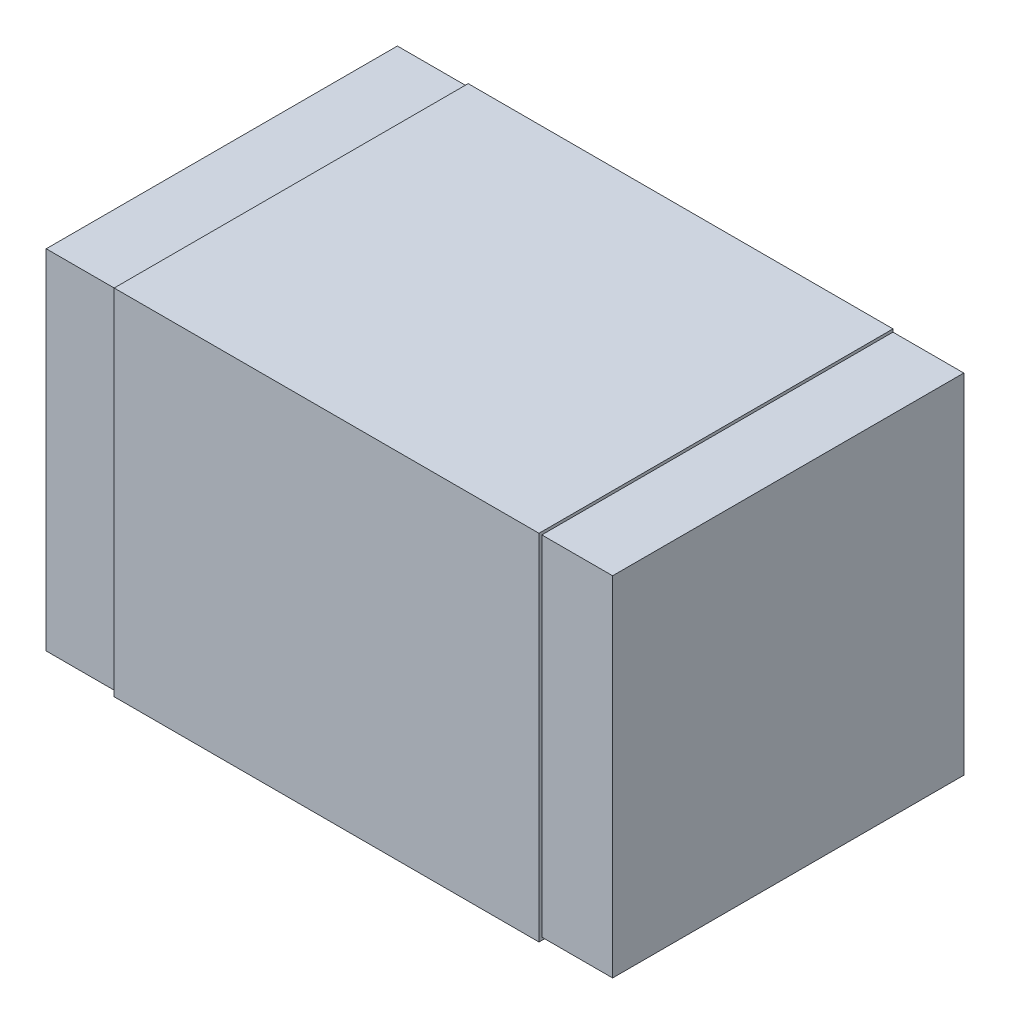
ISO-10303-21;
HEADER;
FILE_DESCRIPTION(('STEP AP214'),'2;1');
FILE_NAME('part.step','',(''),(''),'','','');
FILE_SCHEMA(('AUTOMOTIVE_DESIGN { 1 0 10303 214 1 1 1 1 }'));
ENDSEC;
DATA;
#1=APPLICATION_CONTEXT('core data for automotive mechanical design processes');
#2=APPLICATION_PROTOCOL_DEFINITION('international standard','automotive_design',2000,#1);
#3=PRODUCT_CONTEXT('',#1,'mechanical');
#4=PRODUCT('Part','Part','',(#3));
#5=PRODUCT_RELATED_PRODUCT_CATEGORY('part','',(#4));
#6=PRODUCT_DEFINITION_FORMATION('','',#4);
#7=PRODUCT_DEFINITION_CONTEXT('part definition',#1,'design');
#8=PRODUCT_DEFINITION('design','',#6,#7);
#9=PRODUCT_DEFINITION_SHAPE('','',#8);
#10=(LENGTH_UNIT() NAMED_UNIT(*) SI_UNIT(.MILLI.,.METRE.));
#11=(NAMED_UNIT(*) PLANE_ANGLE_UNIT() SI_UNIT($,.RADIAN.));
#12=(NAMED_UNIT(*) SI_UNIT($,.STERADIAN.) SOLID_ANGLE_UNIT());
#13=UNCERTAINTY_MEASURE_WITH_UNIT(LENGTH_MEASURE(1.E-05),#10,'distance_accuracy_value','');
#14=(GEOMETRIC_REPRESENTATION_CONTEXT(3) GLOBAL_UNCERTAINTY_ASSIGNED_CONTEXT((#13)) GLOBAL_UNIT_ASSIGNED_CONTEXT((#10,
#11,#12)) REPRESENTATION_CONTEXT('',''));
#15=CARTESIAN_POINT('',(0.,0.,0.));
#16=DIRECTION('',(0.,0.,1.));
#17=DIRECTION('',(1.,0.,0.));
#18=AXIS2_PLACEMENT_3D('',#15,#16,#17);
#19=CARTESIAN_POINT('',(0.,0.,1.24));
#20=DIRECTION('',(0.,0.,-1.));
#21=DIRECTION('',(-1.,0.,0.));
#22=AXIS2_PLACEMENT_3D('',#19,#20,#21);
#23=PLANE('',#22);
#24=DIRECTION('',(1.,0.,0.));
#25=VECTOR('',#24,1.);
#26=CARTESIAN_POINT('',(-0.75,0.615,1.24));
#27=LINE('',#26,#25);
#28=CARTESIAN_POINT('',(-1.,0.615,1.24));
#29=VERTEX_POINT('',#28);
#30=CARTESIAN_POINT('',(-0.75,0.615,1.24));
#31=VERTEX_POINT('',#30);
#32=EDGE_CURVE('E131',#29,#31,#27,.T.);
#33=ORIENTED_EDGE('',*,*,#32,.F.);
#34=DIRECTION('',(0.,-1.,0.));
#35=VECTOR('',#34,1.);
#36=CARTESIAN_POINT('',(-1.,0.615,1.24));
#37=LINE('',#36,#35);
#38=CARTESIAN_POINT('',(-1.,-0.615,1.24));
#39=VERTEX_POINT('',#38);
#40=EDGE_CURVE('E133',#39,#29,#37,.F.);
#41=ORIENTED_EDGE('',*,*,#40,.F.);
#42=DIRECTION('',(1.,0.,0.));
#43=VECTOR('',#42,1.);
#44=CARTESIAN_POINT('',(-0.75,-0.615,1.24));
#45=LINE('',#44,#43);
#46=CARTESIAN_POINT('',(-0.75,-0.615,1.24));
#47=VERTEX_POINT('',#46);
#48=EDGE_CURVE('E137',#47,#39,#45,.F.);
#49=ORIENTED_EDGE('',*,*,#48,.F.);
#50=DIRECTION('',(0.,1.,0.));
#51=VECTOR('',#50,1.);
#52=CARTESIAN_POINT('',(-0.75,0.625,1.24));
#53=LINE('',#52,#51);
#54=EDGE_CURVE('E149',#47,#31,#53,.T.);
#55=ORIENTED_EDGE('',*,*,#54,.T.);
#56=EDGE_LOOP('',(#33,#41,#49,#55));
#57=FACE_BOUND('',#56,.T.);
#58=ADVANCED_FACE('F16',(#57),#23,.F.);
#59=CARTESIAN_POINT('',(0.,0.,1.25));
#60=DIRECTION('',(0.,0.,1.));
#61=DIRECTION('',(1.,0.,0.));
#62=AXIS2_PLACEMENT_3D('',#59,#60,#61);
#63=PLANE('',#62);
#64=DIRECTION('',(0.,1.,0.));
#65=VECTOR('',#64,1.);
#66=CARTESIAN_POINT('',(-0.75,0.625,1.25));
#67=LINE('',#66,#65);
#68=CARTESIAN_POINT('',(-0.75,0.625,1.25));
#69=VERTEX_POINT('',#68);
#70=CARTESIAN_POINT('',(-0.75,-0.625,1.25));
#71=VERTEX_POINT('',#70);
#72=EDGE_CURVE('E144',#69,#71,#67,.F.);
#73=ORIENTED_EDGE('',*,*,#72,.T.);
#74=DIRECTION('',(1.,0.,0.));
#75=VECTOR('',#74,1.);
#76=CARTESIAN_POINT('',(-0.75,-0.625,1.25));
#77=LINE('',#76,#75);
#78=CARTESIAN_POINT('',(0.75,-0.625,1.25));
#79=VERTEX_POINT('',#78);
#80=EDGE_CURVE('E157',#71,#79,#77,.T.);
#81=ORIENTED_EDGE('',*,*,#80,.T.);
#82=DIRECTION('',(0.,-1.,0.));
#83=VECTOR('',#82,1.);
#84=CARTESIAN_POINT('',(0.75,0.625,1.25));
#85=LINE('',#84,#83);
#86=CARTESIAN_POINT('',(0.75,0.625,1.25));
#87=VERTEX_POINT('',#86);
#88=EDGE_CURVE('E160',#79,#87,#85,.F.);
#89=ORIENTED_EDGE('',*,*,#88,.T.);
#90=DIRECTION('',(1.,0.,0.));
#91=VECTOR('',#90,1.);
#92=CARTESIAN_POINT('',(-0.75,0.625,1.25));
#93=LINE('',#92,#91);
#94=EDGE_CURVE('E129',#87,#69,#93,.F.);
#95=ORIENTED_EDGE('',*,*,#94,.T.);
#96=EDGE_LOOP('',(#73,#81,#89,#95));
#97=FACE_BOUND('',#96,.T.);
#98=ADVANCED_FACE('F345',(#97),#63,.T.);
#99=CARTESIAN_POINT('',(0.,0.,1.24));
#100=DIRECTION('',(0.,0.,1.));
#101=DIRECTION('',(1.,0.,0.));
#102=AXIS2_PLACEMENT_3D('',#99,#100,#101);
#103=PLANE('',#102);
#104=DIRECTION('',(0.,1.,0.));
#105=VECTOR('',#104,1.);
#106=CARTESIAN_POINT('',(1.,0.615,1.24));
#107=LINE('',#106,#105);
#108=CARTESIAN_POINT('',(1.,0.615,1.24));
#109=VERTEX_POINT('',#108);
#110=CARTESIAN_POINT('',(1.,-0.615,1.24));
#111=VERTEX_POINT('',#110);
#112=EDGE_CURVE('E106',#109,#111,#107,.F.);
#113=ORIENTED_EDGE('',*,*,#112,.F.);
#114=DIRECTION('',(-1.,0.,0.));
#115=VECTOR('',#114,1.);
#116=CARTESIAN_POINT('',(0.75,0.615,1.24));
#117=LINE('',#116,#115);
#118=CARTESIAN_POINT('',(0.75,0.615,1.24));
#119=VERTEX_POINT('',#118);
#120=EDGE_CURVE('E101',#119,#109,#117,.F.);
#121=ORIENTED_EDGE('',*,*,#120,.F.);
#122=DIRECTION('',(0.,-1.,0.));
#123=VECTOR('',#122,1.);
#124=CARTESIAN_POINT('',(0.75,0.625,1.24));
#125=LINE('',#124,#123);
#126=CARTESIAN_POINT('',(0.75,-0.615,1.24));
#127=VERTEX_POINT('',#126);
#128=EDGE_CURVE('E118',#119,#127,#125,.T.);
#129=ORIENTED_EDGE('',*,*,#128,.T.);
#130=DIRECTION('',(1.,0.,0.));
#131=VECTOR('',#130,1.);
#132=CARTESIAN_POINT('',(0.75,-0.615,1.24));
#133=LINE('',#132,#131);
#134=EDGE_CURVE('E19',#111,#127,#133,.F.);
#135=ORIENTED_EDGE('',*,*,#134,.F.);
#136=EDGE_LOOP('',(#113,#121,#129,#135));
#137=FACE_BOUND('',#136,.T.);
#138=ADVANCED_FACE('F116',(#137),#103,.T.);
#139=CARTESIAN_POINT('',(0.75,-0.615,1.24));
#140=DIRECTION('',(0.,-1.,0.));
#141=DIRECTION('',(1.,0.,0.));
#142=AXIS2_PLACEMENT_3D('',#139,#140,#141);
#143=PLANE('',#142);
#144=ORIENTED_EDGE('',*,*,#134,.T.);
#145=DIRECTION('',(0.,0.,1.));
#146=VECTOR('',#145,1.);
#147=CARTESIAN_POINT('',(0.75,-0.615,1.25));
#148=LINE('',#147,#146);
#149=CARTESIAN_POINT('',(0.75,-0.615,0.));
#150=VERTEX_POINT('',#149);
#151=EDGE_CURVE('E168',#127,#150,#148,.F.);
#152=ORIENTED_EDGE('',*,*,#151,.T.);
#153=DIRECTION('',(1.,0.,0.));
#154=VECTOR('',#153,1.);
#155=CARTESIAN_POINT('',(0.,-0.615,0.));
#156=LINE('',#155,#154);
#157=CARTESIAN_POINT('',(1.,-0.615,0.));
#158=VERTEX_POINT('',#157);
#159=EDGE_CURVE('E124',#150,#158,#156,.T.);
#160=ORIENTED_EDGE('',*,*,#159,.T.);
#161=DIRECTION('',(0.,0.,1.));
#162=VECTOR('',#161,1.);
#163=CARTESIAN_POINT('',(1.,-0.615,1.24));
#164=LINE('',#163,#162);
#165=EDGE_CURVE('E111',#111,#158,#164,.F.);
#166=ORIENTED_EDGE('',*,*,#165,.F.);
#167=EDGE_LOOP('',(#144,#152,#160,#166));
#168=FACE_BOUND('',#167,.T.);
#169=ADVANCED_FACE('F123',(#168),#143,.T.);
#170=CARTESIAN_POINT('',(1.,0.615,1.24));
#171=DIRECTION('',(1.,0.,0.));
#172=DIRECTION('',(0.,1.,0.));
#173=AXIS2_PLACEMENT_3D('',#170,#171,#172);
#174=PLANE('',#173);
#175=ORIENTED_EDGE('',*,*,#112,.T.);
#176=ORIENTED_EDGE('',*,*,#165,.T.);
#177=DIRECTION('',(0.,1.,0.));
#178=VECTOR('',#177,1.);
#179=CARTESIAN_POINT('',(1.,0.,0.));
#180=LINE('',#179,#178);
#181=CARTESIAN_POINT('',(1.,0.615,0.));
#182=VERTEX_POINT('',#181);
#183=EDGE_CURVE('E171',#158,#182,#180,.T.);
#184=ORIENTED_EDGE('',*,*,#183,.T.);
#185=DIRECTION('',(0.,0.,1.));
#186=VECTOR('',#185,1.);
#187=CARTESIAN_POINT('',(1.,0.615,1.24));
#188=LINE('',#187,#186);
#189=EDGE_CURVE('E113',#109,#182,#188,.F.);
#190=ORIENTED_EDGE('',*,*,#189,.F.);
#191=EDGE_LOOP('',(#175,#176,#184,#190));
#192=FACE_BOUND('',#191,.T.);
#193=ADVANCED_FACE('F108',(#192),#174,.T.);
#194=CARTESIAN_POINT('',(0.75,0.615,1.24));
#195=DIRECTION('',(0.,1.,0.));
#196=DIRECTION('',(-1.,0.,0.));
#197=AXIS2_PLACEMENT_3D('',#194,#195,#196);
#198=PLANE('',#197);
#199=ORIENTED_EDGE('',*,*,#120,.T.);
#200=ORIENTED_EDGE('',*,*,#189,.T.);
#201=DIRECTION('',(1.,0.,0.));
#202=VECTOR('',#201,1.);
#203=CARTESIAN_POINT('',(0.,0.615,0.));
#204=LINE('',#203,#202);
#205=CARTESIAN_POINT('',(0.75,0.615,0.));
#206=VERTEX_POINT('',#205);
#207=EDGE_CURVE('E173',#182,#206,#204,.F.);
#208=ORIENTED_EDGE('',*,*,#207,.T.);
#209=DIRECTION('',(0.,0.,1.));
#210=VECTOR('',#209,1.);
#211=CARTESIAN_POINT('',(0.75,0.615,1.25));
#212=LINE('',#211,#210);
#213=EDGE_CURVE('E165',#206,#119,#212,.T.);
#214=ORIENTED_EDGE('',*,*,#213,.T.);
#215=EDGE_LOOP('',(#199,#200,#208,#214));
#216=FACE_BOUND('',#215,.T.);
#217=ADVANCED_FACE('F231',(#216),#198,.T.);
#218=CARTESIAN_POINT('',(-0.75,0.625,1.25));
#219=DIRECTION('',(0.,-1.,0.));
#220=DIRECTION('',(0.,0.,-1.));
#221=AXIS2_PLACEMENT_3D('',#218,#219,#220);
#222=PLANE('',#221);
#223=DIRECTION('',(0.,0.,1.));
#224=VECTOR('',#223,1.);
#225=CARTESIAN_POINT('',(-0.75,0.625,1.25));
#226=LINE('',#225,#224);
#227=CARTESIAN_POINT('',(-0.75,0.625,0.));
#228=VERTEX_POINT('',#227);
#229=EDGE_CURVE('E141',#228,#69,#226,.T.);
#230=ORIENTED_EDGE('',*,*,#229,.T.);
#231=ORIENTED_EDGE('',*,*,#94,.F.);
#232=DIRECTION('',(0.,0.,1.));
#233=VECTOR('',#232,1.);
#234=CARTESIAN_POINT('',(0.75,0.625,1.25));
#235=LINE('',#234,#233);
#236=CARTESIAN_POINT('',(0.75,0.625,0.));
#237=VERTEX_POINT('',#236);
#238=EDGE_CURVE('E163',#87,#237,#235,.F.);
#239=ORIENTED_EDGE('',*,*,#238,.T.);
#240=DIRECTION('',(1.,0.,0.));
#241=VECTOR('',#240,1.);
#242=CARTESIAN_POINT('',(0.,0.625,0.));
#243=LINE('',#242,#241);
#244=EDGE_CURVE('E179',#237,#228,#243,.F.);
#245=ORIENTED_EDGE('',*,*,#244,.T.);
#246=EDGE_LOOP('',(#230,#231,#239,#245));
#247=FACE_BOUND('',#246,.T.);
#248=ADVANCED_FACE('F226',(#247),#222,.F.);
#249=CARTESIAN_POINT('',(-0.75,0.615,1.24));
#250=DIRECTION('',(0.,1.,0.));
#251=DIRECTION('',(0.,0.,1.));
#252=AXIS2_PLACEMENT_3D('',#249,#250,#251);
#253=PLANE('',#252);
#254=ORIENTED_EDGE('',*,*,#32,.T.);
#255=DIRECTION('',(0.,0.,1.));
#256=VECTOR('',#255,1.);
#257=CARTESIAN_POINT('',(-0.75,0.615,1.25));
#258=LINE('',#257,#256);
#259=CARTESIAN_POINT('',(-0.75,0.615,0.));
#260=VERTEX_POINT('',#259);
#261=EDGE_CURVE('E152',#31,#260,#258,.F.);
#262=ORIENTED_EDGE('',*,*,#261,.T.);
#263=DIRECTION('',(1.,0.,0.));
#264=VECTOR('',#263,1.);
#265=CARTESIAN_POINT('',(0.,0.615,0.));
#266=LINE('',#265,#264);
#267=CARTESIAN_POINT('',(-1.,0.615,0.));
#268=VERTEX_POINT('',#267);
#269=EDGE_CURVE('E185',#260,#268,#266,.F.);
#270=ORIENTED_EDGE('',*,*,#269,.T.);
#271=DIRECTION('',(0.,0.,1.));
#272=VECTOR('',#271,1.);
#273=CARTESIAN_POINT('',(-1.,0.615,1.24));
#274=LINE('',#273,#272);
#275=EDGE_CURVE('E135',#29,#268,#274,.F.);
#276=ORIENTED_EDGE('',*,*,#275,.F.);
#277=EDGE_LOOP('',(#254,#262,#270,#276));
#278=FACE_BOUND('',#277,.T.);
#279=ADVANCED_FACE('F222',(#278),#253,.T.);
#280=CARTESIAN_POINT('',(-1.,0.615,1.24));
#281=DIRECTION('',(-1.,0.,0.));
#282=DIRECTION('',(0.,-1.,0.));
#283=AXIS2_PLACEMENT_3D('',#280,#281,#282);
#284=PLANE('',#283);
#285=ORIENTED_EDGE('',*,*,#40,.T.);
#286=ORIENTED_EDGE('',*,*,#275,.T.);
#287=DIRECTION('',(0.,1.,0.));
#288=VECTOR('',#287,1.);
#289=CARTESIAN_POINT('',(-1.,0.,0.));
#290=LINE('',#289,#288);
#291=CARTESIAN_POINT('',(-1.,-0.615,0.));
#292=VERTEX_POINT('',#291);
#293=EDGE_CURVE('E188',#268,#292,#290,.F.);
#294=ORIENTED_EDGE('',*,*,#293,.T.);
#295=DIRECTION('',(0.,0.,-1.));
#296=VECTOR('',#295,1.);
#297=CARTESIAN_POINT('',(-1.,-0.615,1.24));
#298=LINE('',#297,#296);
#299=EDGE_CURVE('E139',#39,#292,#298,.T.);
#300=ORIENTED_EDGE('',*,*,#299,.F.);
#301=EDGE_LOOP('',(#285,#286,#294,#300));
#302=FACE_BOUND('',#301,.T.);
#303=ADVANCED_FACE('F218',(#302),#284,.T.);
#304=CARTESIAN_POINT('',(-0.75,-0.615,1.24));
#305=DIRECTION('',(0.,-1.,0.));
#306=DIRECTION('',(0.,0.,-1.));
#307=AXIS2_PLACEMENT_3D('',#304,#305,#306);
#308=PLANE('',#307);
#309=ORIENTED_EDGE('',*,*,#48,.T.);
#310=ORIENTED_EDGE('',*,*,#299,.T.);
#311=DIRECTION('',(1.,0.,0.));
#312=VECTOR('',#311,1.);
#313=CARTESIAN_POINT('',(0.,-0.615,0.));
#314=LINE('',#313,#312);
#315=CARTESIAN_POINT('',(-0.75,-0.615,0.));
#316=VERTEX_POINT('',#315);
#317=EDGE_CURVE('E191',#292,#316,#314,.T.);
#318=ORIENTED_EDGE('',*,*,#317,.T.);
#319=DIRECTION('',(0.,0.,1.));
#320=VECTOR('',#319,1.);
#321=CARTESIAN_POINT('',(-0.75,-0.615,1.25));
#322=LINE('',#321,#320);
#323=EDGE_CURVE('E146',#316,#47,#322,.T.);
#324=ORIENTED_EDGE('',*,*,#323,.T.);
#325=EDGE_LOOP('',(#309,#310,#318,#324));
#326=FACE_BOUND('',#325,.T.);
#327=ADVANCED_FACE('F212',(#326),#308,.T.);
#328=CARTESIAN_POINT('',(-0.75,0.625,1.25));
#329=DIRECTION('',(1.,0.,0.));
#330=DIRECTION('',(0.,1.,0.));
#331=AXIS2_PLACEMENT_3D('',#328,#329,#330);
#332=PLANE('',#331);
#333=ORIENTED_EDGE('',*,*,#54,.F.);
#334=ORIENTED_EDGE('',*,*,#323,.F.);
#335=DIRECTION('',(0.,1.,0.));
#336=VECTOR('',#335,1.);
#337=CARTESIAN_POINT('',(-0.75,0.,0.));
#338=LINE('',#337,#336);
#339=CARTESIAN_POINT('',(-0.75,-0.625,0.));
#340=VERTEX_POINT('',#339);
#341=EDGE_CURVE('E194',#316,#340,#338,.F.);
#342=ORIENTED_EDGE('',*,*,#341,.T.);
#343=DIRECTION('',(0.,0.,1.));
#344=VECTOR('',#343,1.);
#345=CARTESIAN_POINT('',(-0.75,-0.625,1.25));
#346=LINE('',#345,#344);
#347=EDGE_CURVE('E154',#340,#71,#346,.T.);
#348=ORIENTED_EDGE('',*,*,#347,.T.);
#349=ORIENTED_EDGE('',*,*,#72,.F.);
#350=ORIENTED_EDGE('',*,*,#229,.F.);
#351=DIRECTION('',(0.,1.,0.));
#352=VECTOR('',#351,1.);
#353=CARTESIAN_POINT('',(-0.75,0.,0.));
#354=LINE('',#353,#352);
#355=EDGE_CURVE('E182',#228,#260,#354,.F.);
#356=ORIENTED_EDGE('',*,*,#355,.T.);
#357=ORIENTED_EDGE('',*,*,#261,.F.);
#358=EDGE_LOOP('',(#333,#334,#342,#348,#349,#350,#356,#357));
#359=FACE_BOUND('',#358,.T.);
#360=ADVANCED_FACE('F208',(#359),#332,.F.);
#361=CARTESIAN_POINT('',(-0.75,-0.625,1.25));
#362=DIRECTION('',(0.,1.,0.));
#363=DIRECTION('',(0.,0.,1.));
#364=AXIS2_PLACEMENT_3D('',#361,#362,#363);
#365=PLANE('',#364);
#366=DIRECTION('',(0.,0.,1.));
#367=VECTOR('',#366,1.);
#368=CARTESIAN_POINT('',(0.75,-0.625,1.25));
#369=LINE('',#368,#367);
#370=CARTESIAN_POINT('',(0.75,-0.625,0.));
#371=VERTEX_POINT('',#370);
#372=EDGE_CURVE('E33',#371,#79,#369,.T.);
#373=ORIENTED_EDGE('',*,*,#372,.T.);
#374=ORIENTED_EDGE('',*,*,#80,.F.);
#375=ORIENTED_EDGE('',*,*,#347,.F.);
#376=DIRECTION('',(1.,0.,0.));
#377=VECTOR('',#376,1.);
#378=CARTESIAN_POINT('',(0.,-0.625,0.));
#379=LINE('',#378,#377);
#380=EDGE_CURVE('E25',#340,#371,#379,.T.);
#381=ORIENTED_EDGE('',*,*,#380,.T.);
#382=EDGE_LOOP('',(#373,#374,#375,#381));
#383=FACE_BOUND('',#382,.T.);
#384=ADVANCED_FACE('F200',(#383),#365,.F.);
#385=CARTESIAN_POINT('',(0.75,0.625,1.25));
#386=DIRECTION('',(-1.,0.,0.));
#387=DIRECTION('',(0.,-1.,0.));
#388=AXIS2_PLACEMENT_3D('',#385,#386,#387);
#389=PLANE('',#388);
#390=ORIENTED_EDGE('',*,*,#128,.F.);
#391=ORIENTED_EDGE('',*,*,#213,.F.);
#392=DIRECTION('',(0.,1.,0.));
#393=VECTOR('',#392,1.);
#394=CARTESIAN_POINT('',(0.75,0.,0.));
#395=LINE('',#394,#393);
#396=EDGE_CURVE('E176',#206,#237,#395,.T.);
#397=ORIENTED_EDGE('',*,*,#396,.T.);
#398=ORIENTED_EDGE('',*,*,#238,.F.);
#399=ORIENTED_EDGE('',*,*,#88,.F.);
#400=ORIENTED_EDGE('',*,*,#372,.F.);
#401=DIRECTION('',(0.,1.,0.));
#402=VECTOR('',#401,1.);
#403=CARTESIAN_POINT('',(0.75,0.,0.));
#404=LINE('',#403,#402);
#405=EDGE_CURVE('E11',#371,#150,#404,.T.);
#406=ORIENTED_EDGE('',*,*,#405,.T.);
#407=ORIENTED_EDGE('',*,*,#151,.F.);
#408=EDGE_LOOP('',(#390,#391,#397,#398,#399,#400,#406,#407));
#409=FACE_BOUND('',#408,.T.);
#410=ADVANCED_FACE('F230',(#409),#389,.F.);
#411=CARTESIAN_POINT('',(0.,0.,0.));
#412=DIRECTION('',(0.,0.,1.));
#413=DIRECTION('',(1.,0.,0.));
#414=AXIS2_PLACEMENT_3D('',#411,#412,#413);
#415=PLANE('',#414);
#416=ORIENTED_EDGE('',*,*,#380,.F.);
#417=ORIENTED_EDGE('',*,*,#341,.F.);
#418=ORIENTED_EDGE('',*,*,#317,.F.);
#419=ORIENTED_EDGE('',*,*,#293,.F.);
#420=ORIENTED_EDGE('',*,*,#269,.F.);
#421=ORIENTED_EDGE('',*,*,#355,.F.);
#422=ORIENTED_EDGE('',*,*,#244,.F.);
#423=ORIENTED_EDGE('',*,*,#396,.F.);
#424=ORIENTED_EDGE('',*,*,#207,.F.);
#425=ORIENTED_EDGE('',*,*,#183,.F.);
#426=ORIENTED_EDGE('',*,*,#159,.F.);
#427=ORIENTED_EDGE('',*,*,#405,.F.);
#428=EDGE_LOOP('',(#416,#417,#418,#419,#420,#421,#422,#423,#424,#425,#426,#427));
#429=FACE_BOUND('',#428,.T.);
#430=ADVANCED_FACE('F204',(#429),#415,.F.);
#431=CLOSED_SHELL('',(#58,#98,#138,#169,#193,#217,#248,#279,#303,#327,#360,#384,#410,#430));
#432=MANIFOLD_SOLID_BREP('B1',#431);
#433=ADVANCED_BREP_SHAPE_REPRESENTATION('',(#18,#432),#14);
#434=SHAPE_DEFINITION_REPRESENTATION(#9,#433);
ENDSEC;
END-ISO-10303-21;
